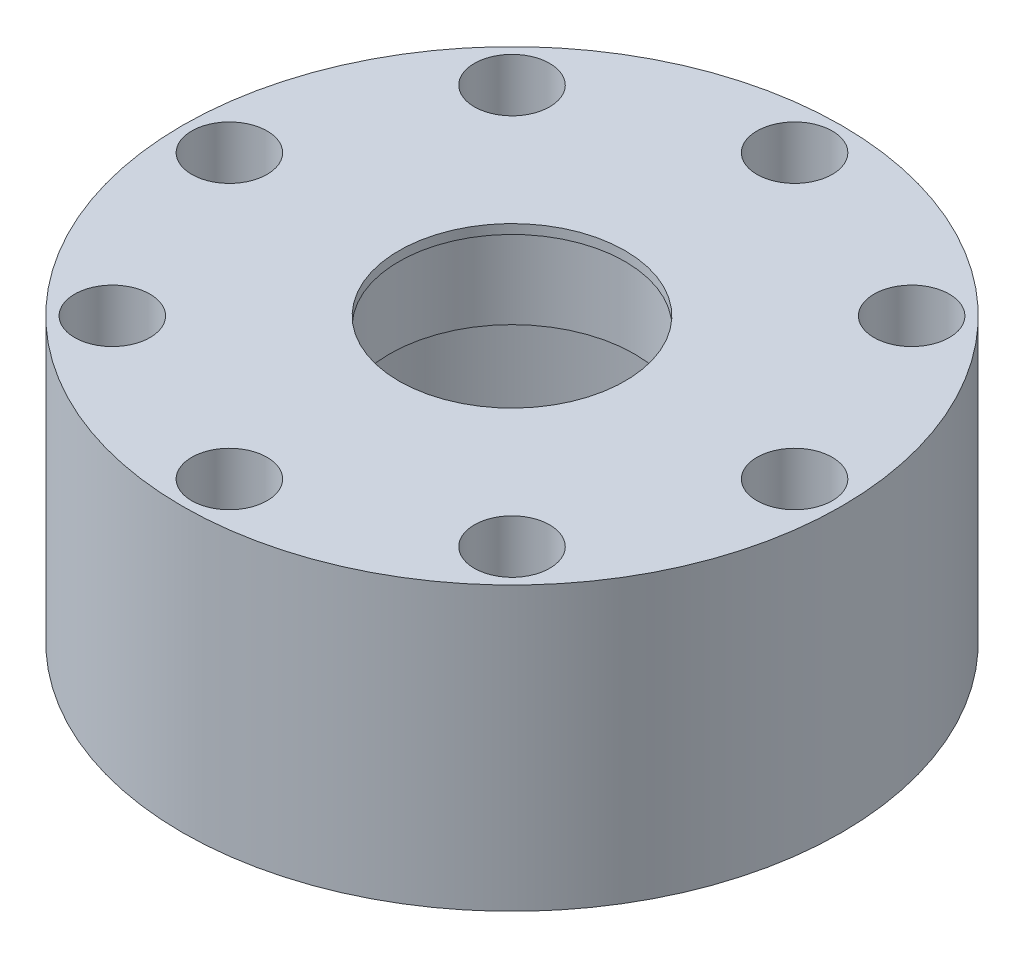
ISO-10303-21;
HEADER;
FILE_DESCRIPTION(('STEP AP214'),'2;1');
FILE_NAME('part.step','',(''),(''),'','','');
FILE_SCHEMA(('AUTOMOTIVE_DESIGN { 1 0 10303 214 1 1 1 1 }'));
ENDSEC;
DATA;
#1=APPLICATION_CONTEXT('core data for automotive mechanical design processes');
#2=APPLICATION_PROTOCOL_DEFINITION('international standard','automotive_design',2000,#1);
#3=PRODUCT_CONTEXT('',#1,'mechanical');
#4=PRODUCT('Part','Part','',(#3));
#5=PRODUCT_RELATED_PRODUCT_CATEGORY('part','',(#4));
#6=PRODUCT_DEFINITION_FORMATION('','',#4);
#7=PRODUCT_DEFINITION_CONTEXT('part definition',#1,'design');
#8=PRODUCT_DEFINITION('design','',#6,#7);
#9=PRODUCT_DEFINITION_SHAPE('','',#8);
#10=(LENGTH_UNIT() NAMED_UNIT(*) SI_UNIT(.MILLI.,.METRE.));
#11=(NAMED_UNIT(*) PLANE_ANGLE_UNIT() SI_UNIT($,.RADIAN.));
#12=(NAMED_UNIT(*) SI_UNIT($,.STERADIAN.) SOLID_ANGLE_UNIT());
#13=UNCERTAINTY_MEASURE_WITH_UNIT(LENGTH_MEASURE(1.E-05),#10,'distance_accuracy_value','');
#14=(GEOMETRIC_REPRESENTATION_CONTEXT(3) GLOBAL_UNCERTAINTY_ASSIGNED_CONTEXT((#13)) GLOBAL_UNIT_ASSIGNED_CONTEXT((#10,
#11,#12)) REPRESENTATION_CONTEXT('',''));
#15=CARTESIAN_POINT('',(0.,0.,0.));
#16=DIRECTION('',(0.,0.,1.));
#17=DIRECTION('',(1.,0.,0.));
#18=AXIS2_PLACEMENT_3D('',#15,#16,#17);
#19=CARTESIAN_POINT('',(0.,0.,0.));
#20=DIRECTION('',(0.,-1.,0.));
#21=DIRECTION('',(0.,0.,-1.));
#22=AXIS2_PLACEMENT_3D('',#19,#20,#21);
#23=CYLINDRICAL_SURFACE('',#22,12.5);
#24=CARTESIAN_POINT('',(0.,0.,0.));
#25=DIRECTION('',(0.,-1.,0.));
#26=DIRECTION('',(0.,0.,-1.));
#27=AXIS2_PLACEMENT_3D('',#24,#25,#26);
#28=CIRCLE('',#27,12.5);
#29=CARTESIAN_POINT('',(0.,0.,-12.5));
#30=VERTEX_POINT('',#29);
#31=EDGE_CURVE('E10',#30,#30,#28,.T.);
#32=ORIENTED_EDGE('',*,*,#31,.T.);
#33=EDGE_LOOP('',(#32));
#34=FACE_BOUND('',#33,.T.);
#35=CARTESIAN_POINT('',(0.,10.,0.));
#36=DIRECTION('',(0.,-1.,0.));
#37=DIRECTION('',(0.,0.,-1.));
#38=AXIS2_PLACEMENT_3D('',#35,#36,#37);
#39=CIRCLE('',#38,12.5);
#40=CARTESIAN_POINT('',(0.,10.,-12.5));
#41=VERTEX_POINT('',#40);
#42=EDGE_CURVE('E73',#41,#41,#39,.T.);
#43=ORIENTED_EDGE('',*,*,#42,.F.);
#44=EDGE_LOOP('',(#43));
#45=FACE_BOUND('',#44,.T.);
#46=ADVANCED_FACE('F33',(#34,#45),#23,.F.);
#47=CARTESIAN_POINT('',(12.5,0.,0.));
#48=DIRECTION('',(0.,-1.,0.));
#49=DIRECTION('',(0.,0.,-1.));
#50=AXIS2_PLACEMENT_3D('',#47,#48,#49);
#51=PLANE('',#50);
#52=CARTESIAN_POINT('',(15.,0.,0.));
#53=DIRECTION('',(0.,1.,0.));
#54=DIRECTION('',(0.,0.,1.));
#55=AXIS2_PLACEMENT_3D('',#52,#53,#54);
#56=CIRCLE('',#55,2.);
#57=CARTESIAN_POINT('',(15.,0.,2.));
#58=VERTEX_POINT('',#57);
#59=EDGE_CURVE('E76',#58,#58,#56,.T.);
#60=ORIENTED_EDGE('',*,*,#59,.T.);
#61=EDGE_LOOP('',(#60));
#62=FACE_BOUND('',#61,.T.);
#63=CARTESIAN_POINT('',(10.6066017177982,0.,10.6066017177982));
#64=DIRECTION('',(0.,1.,0.));
#65=DIRECTION('',(0.,0.,1.));
#66=AXIS2_PLACEMENT_3D('',#63,#64,#65);
#67=CIRCLE('',#66,2.);
#68=CARTESIAN_POINT('',(10.6066017177982,0.,12.6066017177982));
#69=VERTEX_POINT('',#68);
#70=EDGE_CURVE('E116',#69,#69,#67,.T.);
#71=ORIENTED_EDGE('',*,*,#70,.T.);
#72=EDGE_LOOP('',(#71));
#73=FACE_BOUND('',#72,.T.);
#74=CARTESIAN_POINT('',(0.,0.,15.));
#75=DIRECTION('',(0.,1.,0.));
#76=DIRECTION('',(0.,0.,1.));
#77=AXIS2_PLACEMENT_3D('',#74,#75,#76);
#78=CIRCLE('',#77,2.);
#79=CARTESIAN_POINT('',(0.,0.,17.));
#80=VERTEX_POINT('',#79);
#81=EDGE_CURVE('E110',#80,#80,#78,.T.);
#82=ORIENTED_EDGE('',*,*,#81,.T.);
#83=EDGE_LOOP('',(#82));
#84=FACE_BOUND('',#83,.T.);
#85=CARTESIAN_POINT('',(-10.6066017177983,0.,10.6066017177982));
#86=DIRECTION('',(0.,1.,0.));
#87=DIRECTION('',(0.,0.,1.));
#88=AXIS2_PLACEMENT_3D('',#85,#86,#87);
#89=CIRCLE('',#88,2.);
#90=CARTESIAN_POINT('',(-10.6066017177983,0.,12.6066017177982));
#91=VERTEX_POINT('',#90);
#92=EDGE_CURVE('E104',#91,#91,#89,.T.);
#93=ORIENTED_EDGE('',*,*,#92,.T.);
#94=EDGE_LOOP('',(#93));
#95=FACE_BOUND('',#94,.T.);
#96=CARTESIAN_POINT('',(-15.,0.,-1.04744440165294E-13));
#97=DIRECTION('',(0.,1.,0.));
#98=DIRECTION('',(0.,0.,1.));
#99=AXIS2_PLACEMENT_3D('',#96,#97,#98);
#100=CIRCLE('',#99,2.);
#101=CARTESIAN_POINT('',(-15.,0.,1.9999999999999));
#102=VERTEX_POINT('',#101);
#103=EDGE_CURVE('E98',#102,#102,#100,.T.);
#104=ORIENTED_EDGE('',*,*,#103,.T.);
#105=EDGE_LOOP('',(#104));
#106=FACE_BOUND('',#105,.T.);
#107=CARTESIAN_POINT('',(-10.6066017177981,0.,-10.6066017177983));
#108=DIRECTION('',(0.,1.,0.));
#109=DIRECTION('',(0.,0.,1.));
#110=AXIS2_PLACEMENT_3D('',#107,#108,#109);
#111=CIRCLE('',#110,2.);
#112=CARTESIAN_POINT('',(-10.6066017177981,0.,-8.60660171779831));
#113=VERTEX_POINT('',#112);
#114=EDGE_CURVE('E92',#113,#113,#111,.T.);
#115=ORIENTED_EDGE('',*,*,#114,.T.);
#116=EDGE_LOOP('',(#115));
#117=FACE_BOUND('',#116,.T.);
#118=CARTESIAN_POINT('',(1.57116660247941E-13,0.,-15.));
#119=DIRECTION('',(0.,1.,0.));
#120=DIRECTION('',(0.,0.,1.));
#121=AXIS2_PLACEMENT_3D('',#118,#119,#120);
#122=CIRCLE('',#121,2.);
#123=CARTESIAN_POINT('',(1.57116660247941E-13,0.,-13.));
#124=VERTEX_POINT('',#123);
#125=EDGE_CURVE('E86',#124,#124,#122,.T.);
#126=ORIENTED_EDGE('',*,*,#125,.T.);
#127=EDGE_LOOP('',(#126));
#128=FACE_BOUND('',#127,.T.);
#129=CARTESIAN_POINT('',(10.6066017177983,0.,-10.6066017177981));
#130=DIRECTION('',(0.,1.,0.));
#131=DIRECTION('',(0.,0.,1.));
#132=AXIS2_PLACEMENT_3D('',#129,#130,#131);
#133=CIRCLE('',#132,2.);
#134=CARTESIAN_POINT('',(10.6066017177983,0.,-8.60660171779808));
#135=VERTEX_POINT('',#134);
#136=EDGE_CURVE('E80',#135,#135,#133,.T.);
#137=ORIENTED_EDGE('',*,*,#136,.T.);
#138=EDGE_LOOP('',(#137));
#139=FACE_BOUND('',#138,.T.);
#140=CARTESIAN_POINT('',(0.,0.,0.));
#141=DIRECTION('',(0.,-1.,0.));
#142=DIRECTION('',(0.,0.,-1.));
#143=AXIS2_PLACEMENT_3D('',#140,#141,#142);
#144=CIRCLE('',#143,17.5);
#145=CARTESIAN_POINT('',(0.,0.,-17.5));
#146=VERTEX_POINT('',#145);
#147=EDGE_CURVE('E39',#146,#146,#144,.T.);
#148=ORIENTED_EDGE('',*,*,#147,.T.);
#149=EDGE_LOOP('',(#148));
#150=FACE_BOUND('',#149,.T.);
#151=ORIENTED_EDGE('',*,*,#31,.F.);
#152=EDGE_LOOP('',(#151));
#153=FACE_BOUND('',#152,.T.);
#154=ADVANCED_FACE('F125',(#62,#73,#84,#95,#106,#117,#128,#139,#150,#153),#51,.T.);
#155=CARTESIAN_POINT('',(0.,0.,0.));
#156=DIRECTION('',(0.,-1.,0.));
#157=DIRECTION('',(0.,0.,-1.));
#158=AXIS2_PLACEMENT_3D('',#155,#156,#157);
#159=CYLINDRICAL_SURFACE('',#158,17.5);
#160=CARTESIAN_POINT('',(0.,15.,0.));
#161=DIRECTION('',(0.,-1.,0.));
#162=DIRECTION('',(0.,0.,-1.));
#163=AXIS2_PLACEMENT_3D('',#160,#161,#162);
#164=CIRCLE('',#163,17.5);
#165=CARTESIAN_POINT('',(0.,15.,-17.5));
#166=VERTEX_POINT('',#165);
#167=EDGE_CURVE('E43',#166,#166,#164,.T.);
#168=ORIENTED_EDGE('',*,*,#167,.T.);
#169=EDGE_LOOP('',(#168));
#170=FACE_BOUND('',#169,.T.);
#171=ORIENTED_EDGE('',*,*,#147,.F.);
#172=EDGE_LOOP('',(#171));
#173=FACE_BOUND('',#172,.T.);
#174=ADVANCED_FACE('F139',(#170,#173),#159,.T.);
#175=CARTESIAN_POINT('',(6.,15.,0.));
#176=DIRECTION('',(0.,1.,0.));
#177=DIRECTION('',(0.,0.,1.));
#178=AXIS2_PLACEMENT_3D('',#175,#176,#177);
#179=PLANE('',#178);
#180=CARTESIAN_POINT('',(15.,15.,0.));
#181=DIRECTION('',(0.,1.,0.));
#182=DIRECTION('',(0.,0.,1.));
#183=AXIS2_PLACEMENT_3D('',#180,#181,#182);
#184=CIRCLE('',#183,2.);
#185=CARTESIAN_POINT('',(15.,15.,2.));
#186=VERTEX_POINT('',#185);
#187=EDGE_CURVE('E119',#186,#186,#184,.T.);
#188=ORIENTED_EDGE('',*,*,#187,.F.);
#189=EDGE_LOOP('',(#188));
#190=FACE_BOUND('',#189,.T.);
#191=CARTESIAN_POINT('',(10.6066017177982,15.,10.6066017177982));
#192=DIRECTION('',(0.,1.,0.));
#193=DIRECTION('',(0.,0.,1.));
#194=AXIS2_PLACEMENT_3D('',#191,#192,#193);
#195=CIRCLE('',#194,2.);
#196=CARTESIAN_POINT('',(10.6066017177982,15.,12.6066017177982));
#197=VERTEX_POINT('',#196);
#198=EDGE_CURVE('E113',#197,#197,#195,.T.);
#199=ORIENTED_EDGE('',*,*,#198,.F.);
#200=EDGE_LOOP('',(#199));
#201=FACE_BOUND('',#200,.T.);
#202=CARTESIAN_POINT('',(0.,15.,15.));
#203=DIRECTION('',(0.,1.,0.));
#204=DIRECTION('',(0.,0.,1.));
#205=AXIS2_PLACEMENT_3D('',#202,#203,#204);
#206=CIRCLE('',#205,2.);
#207=CARTESIAN_POINT('',(0.,15.,17.));
#208=VERTEX_POINT('',#207);
#209=EDGE_CURVE('E107',#208,#208,#206,.T.);
#210=ORIENTED_EDGE('',*,*,#209,.F.);
#211=EDGE_LOOP('',(#210));
#212=FACE_BOUND('',#211,.T.);
#213=CARTESIAN_POINT('',(-10.6066017177983,15.,10.6066017177982));
#214=DIRECTION('',(0.,1.,0.));
#215=DIRECTION('',(0.,0.,1.));
#216=AXIS2_PLACEMENT_3D('',#213,#214,#215);
#217=CIRCLE('',#216,2.);
#218=CARTESIAN_POINT('',(-10.6066017177983,15.,12.6066017177982));
#219=VERTEX_POINT('',#218);
#220=EDGE_CURVE('E101',#219,#219,#217,.T.);
#221=ORIENTED_EDGE('',*,*,#220,.F.);
#222=EDGE_LOOP('',(#221));
#223=FACE_BOUND('',#222,.T.);
#224=CARTESIAN_POINT('',(-15.,15.,-1.04744440165294E-13));
#225=DIRECTION('',(0.,1.,0.));
#226=DIRECTION('',(0.,0.,1.));
#227=AXIS2_PLACEMENT_3D('',#224,#225,#226);
#228=CIRCLE('',#227,2.);
#229=CARTESIAN_POINT('',(-15.,15.,1.9999999999999));
#230=VERTEX_POINT('',#229);
#231=EDGE_CURVE('E95',#230,#230,#228,.T.);
#232=ORIENTED_EDGE('',*,*,#231,.F.);
#233=EDGE_LOOP('',(#232));
#234=FACE_BOUND('',#233,.T.);
#235=CARTESIAN_POINT('',(-10.6066017177981,15.,-10.6066017177983));
#236=DIRECTION('',(0.,1.,0.));
#237=DIRECTION('',(0.,0.,1.));
#238=AXIS2_PLACEMENT_3D('',#235,#236,#237);
#239=CIRCLE('',#238,2.);
#240=CARTESIAN_POINT('',(-10.6066017177981,15.,-8.60660171779831));
#241=VERTEX_POINT('',#240);
#242=EDGE_CURVE('E89',#241,#241,#239,.T.);
#243=ORIENTED_EDGE('',*,*,#242,.F.);
#244=EDGE_LOOP('',(#243));
#245=FACE_BOUND('',#244,.T.);
#246=CARTESIAN_POINT('',(1.57116660247941E-13,15.,-15.));
#247=DIRECTION('',(0.,1.,0.));
#248=DIRECTION('',(0.,0.,1.));
#249=AXIS2_PLACEMENT_3D('',#246,#247,#248);
#250=CIRCLE('',#249,2.);
#251=CARTESIAN_POINT('',(1.57116660247941E-13,15.,-13.));
#252=VERTEX_POINT('',#251);
#253=EDGE_CURVE('E83',#252,#252,#250,.T.);
#254=ORIENTED_EDGE('',*,*,#253,.F.);
#255=EDGE_LOOP('',(#254));
#256=FACE_BOUND('',#255,.T.);
#257=CARTESIAN_POINT('',(10.6066017177983,15.,-10.6066017177981));
#258=DIRECTION('',(0.,1.,0.));
#259=DIRECTION('',(0.,0.,1.));
#260=AXIS2_PLACEMENT_3D('',#257,#258,#259);
#261=CIRCLE('',#260,2.);
#262=CARTESIAN_POINT('',(10.6066017177983,15.,-8.60660171779808));
#263=VERTEX_POINT('',#262);
#264=EDGE_CURVE('E77',#263,#263,#261,.T.);
#265=ORIENTED_EDGE('',*,*,#264,.F.);
#266=EDGE_LOOP('',(#265));
#267=FACE_BOUND('',#266,.T.);
#268=CARTESIAN_POINT('',(0.,15.,0.));
#269=DIRECTION('',(0.,-1.,0.));
#270=DIRECTION('',(0.,0.,-1.));
#271=AXIS2_PLACEMENT_3D('',#268,#269,#270);
#272=CIRCLE('',#271,6.);
#273=CARTESIAN_POINT('',(0.,15.,-6.));
#274=VERTEX_POINT('',#273);
#275=EDGE_CURVE('E47',#274,#274,#272,.T.);
#276=ORIENTED_EDGE('',*,*,#275,.T.);
#277=EDGE_LOOP('',(#276));
#278=FACE_BOUND('',#277,.T.);
#279=ORIENTED_EDGE('',*,*,#167,.F.);
#280=EDGE_LOOP('',(#279));
#281=FACE_BOUND('',#280,.T.);
#282=ADVANCED_FACE('F135',(#190,#201,#212,#223,#234,#245,#256,#267,#278,#281),#179,.T.);
#283=CARTESIAN_POINT('',(0.,0.,0.));
#284=DIRECTION('',(0.,-1.,0.));
#285=DIRECTION('',(0.,0.,-1.));
#286=AXIS2_PLACEMENT_3D('',#283,#284,#285);
#287=CYLINDRICAL_SURFACE('',#286,6.);
#288=CARTESIAN_POINT('',(0.,14.5,0.));
#289=DIRECTION('',(0.,-1.,0.));
#290=DIRECTION('',(0.,0.,-1.));
#291=AXIS2_PLACEMENT_3D('',#288,#289,#290);
#292=CIRCLE('',#291,6.);
#293=CARTESIAN_POINT('',(0.,14.5,-6.));
#294=VERTEX_POINT('',#293);
#295=EDGE_CURVE('E52',#294,#294,#292,.T.);
#296=ORIENTED_EDGE('',*,*,#295,.T.);
#297=EDGE_LOOP('',(#296));
#298=FACE_BOUND('',#297,.T.);
#299=ORIENTED_EDGE('',*,*,#275,.F.);
#300=EDGE_LOOP('',(#299));
#301=FACE_BOUND('',#300,.T.);
#302=ADVANCED_FACE('F138',(#298,#301),#287,.F.);
#303=CARTESIAN_POINT('',(6.5,14.5,0.));
#304=DIRECTION('',(0.,-1.,0.));
#305=DIRECTION('',(0.,0.,-1.));
#306=AXIS2_PLACEMENT_3D('',#303,#304,#305);
#307=PLANE('',#306);
#308=CARTESIAN_POINT('',(0.,14.5,0.));
#309=DIRECTION('',(0.,-1.,0.));
#310=DIRECTION('',(0.,0.,-1.));
#311=AXIS2_PLACEMENT_3D('',#308,#309,#310);
#312=CIRCLE('',#311,6.5);
#313=CARTESIAN_POINT('',(0.,14.5,-6.5));
#314=VERTEX_POINT('',#313);
#315=EDGE_CURVE('E55',#314,#314,#312,.T.);
#316=ORIENTED_EDGE('',*,*,#315,.T.);
#317=EDGE_LOOP('',(#316));
#318=FACE_BOUND('',#317,.T.);
#319=ORIENTED_EDGE('',*,*,#295,.F.);
#320=EDGE_LOOP('',(#319));
#321=FACE_BOUND('',#320,.T.);
#322=ADVANCED_FACE('F205',(#318,#321),#307,.T.);
#323=CARTESIAN_POINT('',(0.,0.,0.));
#324=DIRECTION('',(0.,-1.,0.));
#325=DIRECTION('',(0.,0.,-1.));
#326=AXIS2_PLACEMENT_3D('',#323,#324,#325);
#327=CYLINDRICAL_SURFACE('',#326,6.5);
#328=CARTESIAN_POINT('',(0.,10.,0.));
#329=DIRECTION('',(0.,-1.,0.));
#330=DIRECTION('',(0.,0.,-1.));
#331=AXIS2_PLACEMENT_3D('',#328,#329,#330);
#332=CIRCLE('',#331,6.5);
#333=CARTESIAN_POINT('',(0.,10.,-6.5));
#334=VERTEX_POINT('',#333);
#335=EDGE_CURVE('E58',#334,#334,#332,.T.);
#336=ORIENTED_EDGE('',*,*,#335,.T.);
#337=EDGE_LOOP('',(#336));
#338=FACE_BOUND('',#337,.T.);
#339=ORIENTED_EDGE('',*,*,#315,.F.);
#340=EDGE_LOOP('',(#339));
#341=FACE_BOUND('',#340,.T.);
#342=ADVANCED_FACE('F199',(#338,#341),#327,.F.);
#343=CARTESIAN_POINT('',(6.5,10.,0.));
#344=DIRECTION('',(0.,-1.,0.));
#345=DIRECTION('',(0.,0.,-1.));
#346=AXIS2_PLACEMENT_3D('',#343,#344,#345);
#347=PLANE('',#346);
#348=CARTESIAN_POINT('',(0.,10.,0.));
#349=DIRECTION('',(0.,-1.,0.));
#350=DIRECTION('',(0.,0.,-1.));
#351=AXIS2_PLACEMENT_3D('',#348,#349,#350);
#352=CIRCLE('',#351,7.5);
#353=CARTESIAN_POINT('',(0.,10.,-7.5));
#354=VERTEX_POINT('',#353);
#355=EDGE_CURVE('E61',#354,#354,#352,.T.);
#356=ORIENTED_EDGE('',*,*,#355,.T.);
#357=EDGE_LOOP('',(#356));
#358=FACE_BOUND('',#357,.T.);
#359=ORIENTED_EDGE('',*,*,#335,.F.);
#360=EDGE_LOOP('',(#359));
#361=FACE_BOUND('',#360,.T.);
#362=ADVANCED_FACE('F193',(#358,#361),#347,.T.);
#363=CARTESIAN_POINT('',(0.,0.,0.));
#364=DIRECTION('',(0.,-1.,0.));
#365=DIRECTION('',(0.,0.,-1.));
#366=AXIS2_PLACEMENT_3D('',#363,#364,#365);
#367=CYLINDRICAL_SURFACE('',#366,7.5);
#368=CARTESIAN_POINT('',(0.,12.,0.));
#369=DIRECTION('',(0.,-1.,0.));
#370=DIRECTION('',(0.,0.,-1.));
#371=AXIS2_PLACEMENT_3D('',#368,#369,#370);
#372=CIRCLE('',#371,7.5);
#373=CARTESIAN_POINT('',(0.,12.,-7.5));
#374=VERTEX_POINT('',#373);
#375=EDGE_CURVE('E64',#374,#374,#372,.T.);
#376=ORIENTED_EDGE('',*,*,#375,.T.);
#377=EDGE_LOOP('',(#376));
#378=FACE_BOUND('',#377,.T.);
#379=ORIENTED_EDGE('',*,*,#355,.F.);
#380=EDGE_LOOP('',(#379));
#381=FACE_BOUND('',#380,.T.);
#382=ADVANCED_FACE('F187',(#378,#381),#367,.T.);
#383=CARTESIAN_POINT('',(10.,12.,0.));
#384=DIRECTION('',(0.,-1.,0.));
#385=DIRECTION('',(0.,0.,-1.));
#386=AXIS2_PLACEMENT_3D('',#383,#384,#385);
#387=PLANE('',#386);
#388=CARTESIAN_POINT('',(0.,12.,0.));
#389=DIRECTION('',(0.,-1.,0.));
#390=DIRECTION('',(0.,0.,-1.));
#391=AXIS2_PLACEMENT_3D('',#388,#389,#390);
#392=CIRCLE('',#391,10.);
#393=CARTESIAN_POINT('',(0.,12.,-10.));
#394=VERTEX_POINT('',#393);
#395=EDGE_CURVE('E67',#394,#394,#392,.T.);
#396=ORIENTED_EDGE('',*,*,#395,.T.);
#397=EDGE_LOOP('',(#396));
#398=FACE_BOUND('',#397,.T.);
#399=ORIENTED_EDGE('',*,*,#375,.F.);
#400=EDGE_LOOP('',(#399));
#401=FACE_BOUND('',#400,.T.);
#402=ADVANCED_FACE('F181',(#398,#401),#387,.T.);
#403=CARTESIAN_POINT('',(0.,0.,0.));
#404=DIRECTION('',(0.,-1.,0.));
#405=DIRECTION('',(0.,0.,-1.));
#406=AXIS2_PLACEMENT_3D('',#403,#404,#405);
#407=CYLINDRICAL_SURFACE('',#406,10.);
#408=CARTESIAN_POINT('',(0.,10.,0.));
#409=DIRECTION('',(0.,-1.,0.));
#410=DIRECTION('',(0.,0.,-1.));
#411=AXIS2_PLACEMENT_3D('',#408,#409,#410);
#412=CIRCLE('',#411,10.);
#413=CARTESIAN_POINT('',(0.,10.,-10.));
#414=VERTEX_POINT('',#413);
#415=EDGE_CURVE('E70',#414,#414,#412,.T.);
#416=ORIENTED_EDGE('',*,*,#415,.T.);
#417=EDGE_LOOP('',(#416));
#418=FACE_BOUND('',#417,.T.);
#419=ORIENTED_EDGE('',*,*,#395,.F.);
#420=EDGE_LOOP('',(#419));
#421=FACE_BOUND('',#420,.T.);
#422=ADVANCED_FACE('F175',(#418,#421),#407,.F.);
#423=CARTESIAN_POINT('',(10.,10.,0.));
#424=DIRECTION('',(0.,-1.,0.));
#425=DIRECTION('',(0.,0.,-1.));
#426=AXIS2_PLACEMENT_3D('',#423,#424,#425);
#427=PLANE('',#426);
#428=ORIENTED_EDGE('',*,*,#42,.T.);
#429=EDGE_LOOP('',(#428));
#430=FACE_BOUND('',#429,.T.);
#431=ORIENTED_EDGE('',*,*,#415,.F.);
#432=EDGE_LOOP('',(#431));
#433=FACE_BOUND('',#432,.T.);
#434=ADVANCED_FACE('F171',(#430,#433),#427,.T.);
#435=CARTESIAN_POINT('',(10.6066017177983,0.,-10.6066017177981));
#436=DIRECTION('',(0.,1.,0.));
#437=DIRECTION('',(0.,0.,1.));
#438=AXIS2_PLACEMENT_3D('',#435,#436,#437);
#439=CYLINDRICAL_SURFACE('',#438,2.);
#440=ORIENTED_EDGE('',*,*,#136,.F.);
#441=EDGE_LOOP('',(#440));
#442=FACE_BOUND('',#441,.T.);
#443=ORIENTED_EDGE('',*,*,#264,.T.);
#444=EDGE_LOOP('',(#443));
#445=FACE_BOUND('',#444,.T.);
#446=ADVANCED_FACE('F174',(#442,#445),#439,.F.);
#447=CARTESIAN_POINT('',(1.57116660247941E-13,0.,-15.));
#448=DIRECTION('',(0.,1.,0.));
#449=DIRECTION('',(0.,0.,1.));
#450=AXIS2_PLACEMENT_3D('',#447,#448,#449);
#451=CYLINDRICAL_SURFACE('',#450,2.);
#452=ORIENTED_EDGE('',*,*,#125,.F.);
#453=EDGE_LOOP('',(#452));
#454=FACE_BOUND('',#453,.T.);
#455=ORIENTED_EDGE('',*,*,#253,.T.);
#456=EDGE_LOOP('',(#455));
#457=FACE_BOUND('',#456,.T.);
#458=ADVANCED_FACE('F222',(#454,#457),#451,.F.);
#459=CARTESIAN_POINT('',(-10.6066017177981,0.,-10.6066017177983));
#460=DIRECTION('',(0.,1.,0.));
#461=DIRECTION('',(0.,0.,1.));
#462=AXIS2_PLACEMENT_3D('',#459,#460,#461);
#463=CYLINDRICAL_SURFACE('',#462,2.);
#464=ORIENTED_EDGE('',*,*,#114,.F.);
#465=EDGE_LOOP('',(#464));
#466=FACE_BOUND('',#465,.T.);
#467=ORIENTED_EDGE('',*,*,#242,.T.);
#468=EDGE_LOOP('',(#467));
#469=FACE_BOUND('',#468,.T.);
#470=ADVANCED_FACE('F226',(#466,#469),#463,.F.);
#471=CARTESIAN_POINT('',(-15.,0.,-1.04744440165294E-13));
#472=DIRECTION('',(0.,1.,0.));
#473=DIRECTION('',(0.,0.,1.));
#474=AXIS2_PLACEMENT_3D('',#471,#472,#473);
#475=CYLINDRICAL_SURFACE('',#474,2.);
#476=ORIENTED_EDGE('',*,*,#103,.F.);
#477=EDGE_LOOP('',(#476));
#478=FACE_BOUND('',#477,.T.);
#479=ORIENTED_EDGE('',*,*,#231,.T.);
#480=EDGE_LOOP('',(#479));
#481=FACE_BOUND('',#480,.T.);
#482=ADVANCED_FACE('F230',(#478,#481),#475,.F.);
#483=CARTESIAN_POINT('',(-10.6066017177983,0.,10.6066017177982));
#484=DIRECTION('',(0.,1.,0.));
#485=DIRECTION('',(0.,0.,1.));
#486=AXIS2_PLACEMENT_3D('',#483,#484,#485);
#487=CYLINDRICAL_SURFACE('',#486,2.);
#488=ORIENTED_EDGE('',*,*,#92,.F.);
#489=EDGE_LOOP('',(#488));
#490=FACE_BOUND('',#489,.T.);
#491=ORIENTED_EDGE('',*,*,#220,.T.);
#492=EDGE_LOOP('',(#491));
#493=FACE_BOUND('',#492,.T.);
#494=ADVANCED_FACE('F234',(#490,#493),#487,.F.);
#495=CARTESIAN_POINT('',(0.,0.,15.));
#496=DIRECTION('',(0.,1.,0.));
#497=DIRECTION('',(0.,0.,1.));
#498=AXIS2_PLACEMENT_3D('',#495,#496,#497);
#499=CYLINDRICAL_SURFACE('',#498,2.);
#500=ORIENTED_EDGE('',*,*,#81,.F.);
#501=EDGE_LOOP('',(#500));
#502=FACE_BOUND('',#501,.T.);
#503=ORIENTED_EDGE('',*,*,#209,.T.);
#504=EDGE_LOOP('',(#503));
#505=FACE_BOUND('',#504,.T.);
#506=ADVANCED_FACE('F238',(#502,#505),#499,.F.);
#507=CARTESIAN_POINT('',(10.6066017177982,0.,10.6066017177982));
#508=DIRECTION('',(0.,1.,0.));
#509=DIRECTION('',(0.,0.,1.));
#510=AXIS2_PLACEMENT_3D('',#507,#508,#509);
#511=CYLINDRICAL_SURFACE('',#510,2.);
#512=ORIENTED_EDGE('',*,*,#70,.F.);
#513=EDGE_LOOP('',(#512));
#514=FACE_BOUND('',#513,.T.);
#515=ORIENTED_EDGE('',*,*,#198,.T.);
#516=EDGE_LOOP('',(#515));
#517=FACE_BOUND('',#516,.T.);
#518=ADVANCED_FACE('F131',(#514,#517),#511,.F.);
#519=CARTESIAN_POINT('',(15.,0.,0.));
#520=DIRECTION('',(0.,1.,0.));
#521=DIRECTION('',(0.,0.,1.));
#522=AXIS2_PLACEMENT_3D('',#519,#520,#521);
#523=CYLINDRICAL_SURFACE('',#522,2.);
#524=ORIENTED_EDGE('',*,*,#59,.F.);
#525=EDGE_LOOP('',(#524));
#526=FACE_BOUND('',#525,.T.);
#527=ORIENTED_EDGE('',*,*,#187,.T.);
#528=EDGE_LOOP('',(#527));
#529=FACE_BOUND('',#528,.T.);
#530=ADVANCED_FACE('F128',(#526,#529),#523,.F.);
#531=CLOSED_SHELL('',(#46,#154,#174,#282,#302,#322,#342,#362,#382,#402,#422,#434,#446,#458,#470,
#482,#494,#506,#518,#530));
#532=MANIFOLD_SOLID_BREP('B2',#531);
#533=ADVANCED_BREP_SHAPE_REPRESENTATION('',(#18,#532),#14);
#534=SHAPE_DEFINITION_REPRESENTATION(#9,#533);
ENDSEC;
END-ISO-10303-21;
